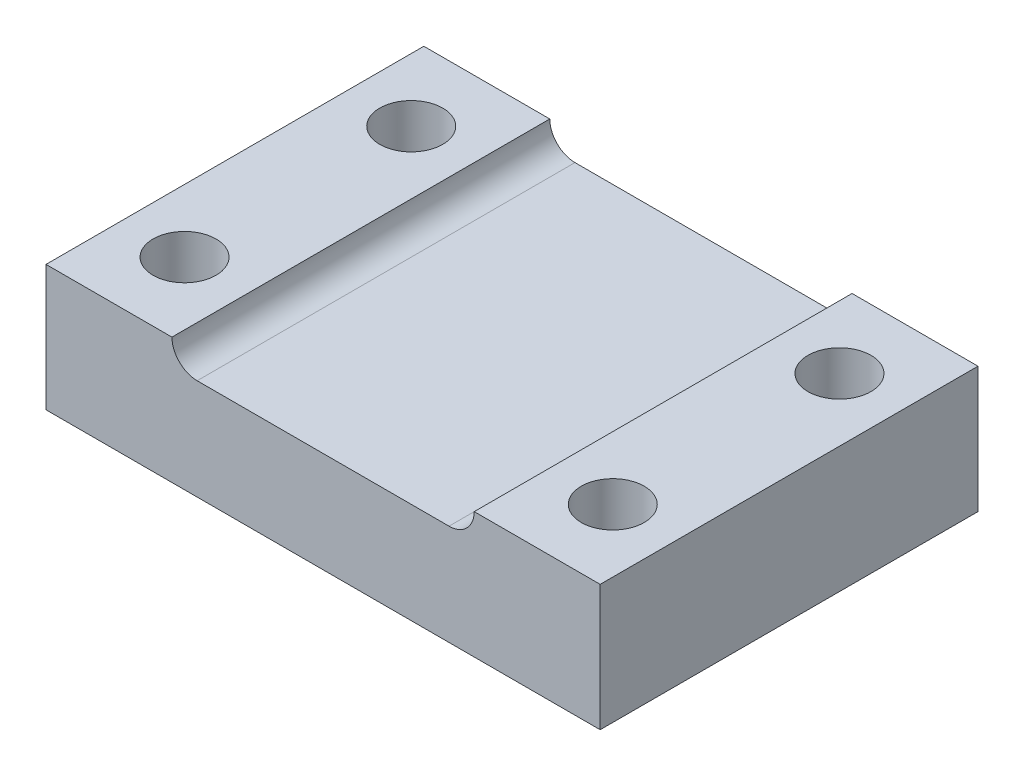
ISO-10303-21;
HEADER;
FILE_DESCRIPTION(('STEP AP214'),'2;1');
FILE_NAME('part.step','',(''),(''),'','','');
FILE_SCHEMA(('AUTOMOTIVE_DESIGN { 1 0 10303 214 1 1 1 1 }'));
ENDSEC;
DATA;
#1=APPLICATION_CONTEXT('core data for automotive mechanical design processes');
#2=APPLICATION_PROTOCOL_DEFINITION('international standard','automotive_design',2000,#1);
#3=PRODUCT_CONTEXT('',#1,'mechanical');
#4=PRODUCT('Part','Part','',(#3));
#5=PRODUCT_RELATED_PRODUCT_CATEGORY('part','',(#4));
#6=PRODUCT_DEFINITION_FORMATION('','',#4);
#7=PRODUCT_DEFINITION_CONTEXT('part definition',#1,'design');
#8=PRODUCT_DEFINITION('design','',#6,#7);
#9=PRODUCT_DEFINITION_SHAPE('','',#8);
#10=(LENGTH_UNIT() NAMED_UNIT(*) SI_UNIT(.MILLI.,.METRE.));
#11=(NAMED_UNIT(*) PLANE_ANGLE_UNIT() SI_UNIT($,.RADIAN.));
#12=(NAMED_UNIT(*) SI_UNIT($,.STERADIAN.) SOLID_ANGLE_UNIT());
#13=UNCERTAINTY_MEASURE_WITH_UNIT(LENGTH_MEASURE(1.E-05),#10,'distance_accuracy_value','');
#14=(GEOMETRIC_REPRESENTATION_CONTEXT(3) GLOBAL_UNCERTAINTY_ASSIGNED_CONTEXT((#13)) GLOBAL_UNIT_ASSIGNED_CONTEXT((#10,
#11,#12)) REPRESENTATION_CONTEXT('',''));
#15=CARTESIAN_POINT('',(0.,0.,0.));
#16=DIRECTION('',(0.,0.,1.));
#17=DIRECTION('',(1.,0.,0.));
#18=AXIS2_PLACEMENT_3D('',#15,#16,#17);
#19=CARTESIAN_POINT('',(9.,0.,-0.00999999999999959));
#20=DIRECTION('',(0.,1.,0.));
#21=DIRECTION('',(0.,0.,1.));
#22=AXIS2_PLACEMENT_3D('',#19,#20,#21);
#23=PLANE('',#22);
#24=CARTESIAN_POINT('',(-8.5,0.,3.));
#25=DIRECTION('',(0.,1.,0.));
#26=DIRECTION('',(0.,0.,-1.));
#27=AXIS2_PLACEMENT_3D('',#24,#25,#26);
#28=CIRCLE('',#27,1.25);
#29=CARTESIAN_POINT('',(-8.5,0.,1.75));
#30=VERTEX_POINT('',#29);
#31=EDGE_CURVE('E406',#30,#30,#28,.T.);
#32=ORIENTED_EDGE('',*,*,#31,.F.);
#33=EDGE_LOOP('',(#32));
#34=FACE_BOUND('',#33,.T.);
#35=CARTESIAN_POINT('',(-8.49999999999999,0.,12.));
#36=DIRECTION('',(0.,1.,0.));
#37=DIRECTION('',(0.,0.,-1.));
#38=AXIS2_PLACEMENT_3D('',#35,#36,#37);
#39=CIRCLE('',#38,1.25);
#40=CARTESIAN_POINT('',(-8.49999999999999,0.,10.75));
#41=VERTEX_POINT('',#40);
#42=EDGE_CURVE('E405',#41,#41,#39,.T.);
#43=ORIENTED_EDGE('',*,*,#42,.F.);
#44=EDGE_LOOP('',(#43));
#45=FACE_BOUND('',#44,.T.);
#46=DIRECTION('',(0.,0.,-1.));
#47=VECTOR('',#46,1.);
#48=CARTESIAN_POINT('',(-6.,0.,15.));
#49=LINE('',#48,#47);
#50=CARTESIAN_POINT('',(-6.,0.,0.));
#51=VERTEX_POINT('',#50);
#52=CARTESIAN_POINT('',(-6.,0.,15.));
#53=VERTEX_POINT('',#52);
#54=EDGE_CURVE('E183',#51,#53,#49,.F.);
#55=ORIENTED_EDGE('',*,*,#54,.F.);
#56=DIRECTION('',(-1.,0.,0.));
#57=VECTOR('',#56,1.);
#58=CARTESIAN_POINT('',(0.,0.,0.));
#59=LINE('',#58,#57);
#60=CARTESIAN_POINT('',(-11.,0.,0.));
#61=VERTEX_POINT('',#60);
#62=EDGE_CURVE('E123',#51,#61,#59,.T.);
#63=ORIENTED_EDGE('',*,*,#62,.T.);
#64=DIRECTION('',(0.,0.,-1.));
#65=VECTOR('',#64,1.);
#66=CARTESIAN_POINT('',(-11.,0.,0.));
#67=LINE('',#66,#65);
#68=CARTESIAN_POINT('',(-11.,0.,15.));
#69=VERTEX_POINT('',#68);
#70=EDGE_CURVE('E161',#69,#61,#67,.T.);
#71=ORIENTED_EDGE('',*,*,#70,.F.);
#72=DIRECTION('',(-1.,0.,0.));
#73=VECTOR('',#72,1.);
#74=CARTESIAN_POINT('',(0.,0.,15.));
#75=LINE('',#74,#73);
#76=EDGE_CURVE('E186',#53,#69,#75,.T.);
#77=ORIENTED_EDGE('',*,*,#76,.F.);
#78=EDGE_LOOP('',(#55,#63,#71,#77));
#79=FACE_BOUND('',#78,.T.);
#80=ADVANCED_FACE('F39',(#34,#45,#79),#23,.T.);
#81=CARTESIAN_POINT('',(8.5,0.,12.));
#82=DIRECTION('',(0.,1.,0.));
#83=DIRECTION('',(0.,0.,1.));
#84=AXIS2_PLACEMENT_3D('',#81,#82,#83);
#85=CIRCLE('',#84,1.25);
#86=CARTESIAN_POINT('',(8.5,0.,13.25));
#87=VERTEX_POINT('',#86);
#88=EDGE_CURVE('E419',#87,#87,#85,.T.);
#89=ORIENTED_EDGE('',*,*,#88,.F.);
#90=EDGE_LOOP('',(#89));
#91=FACE_BOUND('',#90,.T.);
#92=CARTESIAN_POINT('',(8.5,0.,3.));
#93=DIRECTION('',(0.,1.,0.));
#94=DIRECTION('',(0.,0.,1.));
#95=AXIS2_PLACEMENT_3D('',#92,#93,#94);
#96=CIRCLE('',#95,1.25);
#97=CARTESIAN_POINT('',(8.5,0.,4.25));
#98=VERTEX_POINT('',#97);
#99=EDGE_CURVE('E144',#98,#98,#96,.T.);
#100=ORIENTED_EDGE('',*,*,#99,.F.);
#101=EDGE_LOOP('',(#100));
#102=FACE_BOUND('',#101,.T.);
#103=CARTESIAN_POINT('',(11.,0.,15.));
#104=VERTEX_POINT('',#103);
#105=CARTESIAN_POINT('',(6.,0.,15.));
#106=VERTEX_POINT('',#105);
#107=EDGE_CURVE('E189',#104,#106,#75,.T.);
#108=ORIENTED_EDGE('',*,*,#107,.F.);
#109=DIRECTION('',(0.,0.,1.));
#110=VECTOR('',#109,1.);
#111=CARTESIAN_POINT('',(11.,0.,15.));
#112=LINE('',#111,#110);
#113=CARTESIAN_POINT('',(11.,0.,0.));
#114=VERTEX_POINT('',#113);
#115=EDGE_CURVE('E138',#114,#104,#112,.T.);
#116=ORIENTED_EDGE('',*,*,#115,.F.);
#117=CARTESIAN_POINT('',(6.,0.,0.));
#118=VERTEX_POINT('',#117);
#119=EDGE_CURVE('E192',#114,#118,#59,.T.);
#120=ORIENTED_EDGE('',*,*,#119,.T.);
#121=DIRECTION('',(0.,0.,-1.));
#122=VECTOR('',#121,1.);
#123=CARTESIAN_POINT('',(6.,0.,15.));
#124=LINE('',#123,#122);
#125=EDGE_CURVE('E75',#106,#118,#124,.T.);
#126=ORIENTED_EDGE('',*,*,#125,.F.);
#127=EDGE_LOOP('',(#108,#116,#120,#126));
#128=FACE_BOUND('',#127,.T.);
#129=ADVANCED_FACE('F204',(#91,#102,#128),#23,.T.);
#130=CARTESIAN_POINT('',(-5.,-1.,15.));
#131=DIRECTION('',(0.,1.,0.));
#132=DIRECTION('',(-1.,0.,0.));
#133=AXIS2_PLACEMENT_3D('',#130,#131,#132);
#134=PLANE('',#133);
#135=DIRECTION('',(1.,0.,0.));
#136=VECTOR('',#135,1.);
#137=CARTESIAN_POINT('',(-5.,-1.,0.));
#138=LINE('',#137,#136);
#139=CARTESIAN_POINT('',(-5.,-1.,0.));
#140=VERTEX_POINT('',#139);
#141=CARTESIAN_POINT('',(5.,-1.,0.));
#142=VERTEX_POINT('',#141);
#143=EDGE_CURVE('E49',#140,#142,#138,.T.);
#144=ORIENTED_EDGE('',*,*,#143,.F.);
#145=DIRECTION('',(0.,0.,-1.));
#146=VECTOR('',#145,1.);
#147=CARTESIAN_POINT('',(-5.,-1.,15.));
#148=LINE('',#147,#146);
#149=CARTESIAN_POINT('',(-5.,-1.,15.));
#150=VERTEX_POINT('',#149);
#151=EDGE_CURVE('E167',#150,#140,#148,.T.);
#152=ORIENTED_EDGE('',*,*,#151,.F.);
#153=DIRECTION('',(1.,0.,0.));
#154=VECTOR('',#153,1.);
#155=CARTESIAN_POINT('',(-5.,-1.,15.));
#156=LINE('',#155,#154);
#157=CARTESIAN_POINT('',(5.,-1.,15.));
#158=VERTEX_POINT('',#157);
#159=EDGE_CURVE('E66',#150,#158,#156,.T.);
#160=ORIENTED_EDGE('',*,*,#159,.T.);
#161=DIRECTION('',(0.,0.,-1.));
#162=VECTOR('',#161,1.);
#163=CARTESIAN_POINT('',(5.,-1.,15.));
#164=LINE('',#163,#162);
#165=EDGE_CURVE('E171',#158,#142,#164,.T.);
#166=ORIENTED_EDGE('',*,*,#165,.T.);
#167=EDGE_LOOP('',(#144,#152,#160,#166));
#168=FACE_BOUND('',#167,.T.);
#169=ADVANCED_FACE('F206',(#168),#134,.T.);
#170=CARTESIAN_POINT('',(0.,0.,0.));
#171=DIRECTION('',(0.,0.,1.));
#172=DIRECTION('',(1.,0.,0.));
#173=AXIS2_PLACEMENT_3D('',#170,#171,#172);
#174=PLANE('',#173);
#175=ORIENTED_EDGE('',*,*,#119,.F.);
#176=DIRECTION('',(0.,1.,0.));
#177=VECTOR('',#176,1.);
#178=CARTESIAN_POINT('',(11.,0.,0.));
#179=LINE('',#178,#177);
#180=CARTESIAN_POINT('',(11.,-5.,0.));
#181=VERTEX_POINT('',#180);
#182=EDGE_CURVE('E133',#181,#114,#179,.T.);
#183=ORIENTED_EDGE('',*,*,#182,.F.);
#184=DIRECTION('',(1.,0.,0.));
#185=VECTOR('',#184,1.);
#186=CARTESIAN_POINT('',(-9.,-5.,0.));
#187=LINE('',#186,#185);
#188=CARTESIAN_POINT('',(-11.,-5.,0.));
#189=VERTEX_POINT('',#188);
#190=EDGE_CURVE('E124',#189,#181,#187,.T.);
#191=ORIENTED_EDGE('',*,*,#190,.F.);
#192=DIRECTION('',(0.,-1.,0.));
#193=VECTOR('',#192,1.);
#194=CARTESIAN_POINT('',(-11.,0.,0.));
#195=LINE('',#194,#193);
#196=EDGE_CURVE('E152',#61,#189,#195,.T.);
#197=ORIENTED_EDGE('',*,*,#196,.F.);
#198=ORIENTED_EDGE('',*,*,#62,.F.);
#199=CARTESIAN_POINT('',(-5.,0.,0.));
#200=DIRECTION('',(0.,0.,1.));
#201=DIRECTION('',(1.,0.,0.));
#202=AXIS2_PLACEMENT_3D('',#199,#200,#201);
#203=CIRCLE('',#202,1.);
#204=EDGE_CURVE('E11',#51,#140,#203,.T.);
#205=ORIENTED_EDGE('',*,*,#204,.T.);
#206=ORIENTED_EDGE('',*,*,#143,.T.);
#207=CARTESIAN_POINT('',(5.,0.,0.));
#208=DIRECTION('',(0.,0.,1.));
#209=DIRECTION('',(1.,0.,0.));
#210=AXIS2_PLACEMENT_3D('',#207,#208,#209);
#211=CIRCLE('',#210,1.);
#212=EDGE_CURVE('E177',#142,#118,#211,.T.);
#213=ORIENTED_EDGE('',*,*,#212,.T.);
#214=EDGE_LOOP('',(#175,#183,#191,#197,#198,#205,#206,#213));
#215=FACE_BOUND('',#214,.T.);
#216=ADVANCED_FACE('F198',(#215),#174,.F.);
#217=CARTESIAN_POINT('',(0.,0.,15.));
#218=DIRECTION('',(0.,0.,1.));
#219=DIRECTION('',(1.,0.,0.));
#220=AXIS2_PLACEMENT_3D('',#217,#218,#219);
#221=PLANE('',#220);
#222=DIRECTION('',(-1.,0.,0.));
#223=VECTOR('',#222,1.);
#224=CARTESIAN_POINT('',(-9.,-5.,15.));
#225=LINE('',#224,#223);
#226=CARTESIAN_POINT('',(11.,-5.,15.));
#227=VERTEX_POINT('',#226);
#228=CARTESIAN_POINT('',(-11.,-5.,15.));
#229=VERTEX_POINT('',#228);
#230=EDGE_CURVE('E111',#227,#229,#225,.T.);
#231=ORIENTED_EDGE('',*,*,#230,.F.);
#232=DIRECTION('',(0.,-1.,0.));
#233=VECTOR('',#232,1.);
#234=CARTESIAN_POINT('',(11.,0.,15.));
#235=LINE('',#234,#233);
#236=EDGE_CURVE('E116',#104,#227,#235,.T.);
#237=ORIENTED_EDGE('',*,*,#236,.F.);
#238=ORIENTED_EDGE('',*,*,#107,.T.);
#239=CARTESIAN_POINT('',(5.,0.,15.));
#240=DIRECTION('',(0.,0.,1.));
#241=DIRECTION('',(1.,0.,0.));
#242=AXIS2_PLACEMENT_3D('',#239,#240,#241);
#243=CIRCLE('',#242,1.);
#244=EDGE_CURVE('E174',#158,#106,#243,.T.);
#245=ORIENTED_EDGE('',*,*,#244,.F.);
#246=ORIENTED_EDGE('',*,*,#159,.F.);
#247=CARTESIAN_POINT('',(-5.,0.,15.));
#248=DIRECTION('',(0.,0.,1.));
#249=DIRECTION('',(1.,0.,0.));
#250=AXIS2_PLACEMENT_3D('',#247,#248,#249);
#251=CIRCLE('',#250,1.);
#252=EDGE_CURVE('E180',#53,#150,#251,.T.);
#253=ORIENTED_EDGE('',*,*,#252,.F.);
#254=ORIENTED_EDGE('',*,*,#76,.T.);
#255=DIRECTION('',(0.,1.,0.));
#256=VECTOR('',#255,1.);
#257=CARTESIAN_POINT('',(-11.,0.,15.));
#258=LINE('',#257,#256);
#259=EDGE_CURVE('E118',#229,#69,#258,.T.);
#260=ORIENTED_EDGE('',*,*,#259,.F.);
#261=EDGE_LOOP('',(#231,#237,#238,#245,#246,#253,#254,#260));
#262=FACE_BOUND('',#261,.T.);
#263=ADVANCED_FACE('F113',(#262),#221,.T.);
#264=CARTESIAN_POINT('',(5.,0.,15.));
#265=DIRECTION('',(0.,0.,-1.));
#266=DIRECTION('',(-1.,0.,0.));
#267=AXIS2_PLACEMENT_3D('',#264,#265,#266);
#268=CYLINDRICAL_SURFACE('',#267,1.);
#269=ORIENTED_EDGE('',*,*,#244,.T.);
#270=ORIENTED_EDGE('',*,*,#125,.T.);
#271=ORIENTED_EDGE('',*,*,#212,.F.);
#272=ORIENTED_EDGE('',*,*,#165,.F.);
#273=EDGE_LOOP('',(#269,#270,#271,#272));
#274=FACE_BOUND('',#273,.T.);
#275=ADVANCED_FACE('F41',(#274),#268,.F.);
#276=CARTESIAN_POINT('',(-5.,0.,15.));
#277=DIRECTION('',(0.,0.,-1.));
#278=DIRECTION('',(-1.,0.,0.));
#279=AXIS2_PLACEMENT_3D('',#276,#277,#278);
#280=CYLINDRICAL_SURFACE('',#279,1.);
#281=ORIENTED_EDGE('',*,*,#204,.F.);
#282=ORIENTED_EDGE('',*,*,#54,.T.);
#283=ORIENTED_EDGE('',*,*,#252,.T.);
#284=ORIENTED_EDGE('',*,*,#151,.T.);
#285=EDGE_LOOP('',(#281,#282,#283,#284));
#286=FACE_BOUND('',#285,.T.);
#287=ADVANCED_FACE('F209',(#286),#280,.F.);
#288=CARTESIAN_POINT('',(0.,-5.,0.));
#289=DIRECTION('',(0.,-1.,0.));
#290=DIRECTION('',(0.,0.,-1.));
#291=AXIS2_PLACEMENT_3D('',#288,#289,#290);
#292=PLANE('',#291);
#293=ORIENTED_EDGE('',*,*,#230,.T.);
#294=DIRECTION('',(0.,0.,1.));
#295=VECTOR('',#294,1.);
#296=CARTESIAN_POINT('',(-11.,-5.,0.));
#297=LINE('',#296,#295);
#298=EDGE_CURVE('E156',#189,#229,#297,.T.);
#299=ORIENTED_EDGE('',*,*,#298,.F.);
#300=ORIENTED_EDGE('',*,*,#190,.T.);
#301=DIRECTION('',(0.,0.,-1.));
#302=VECTOR('',#301,1.);
#303=CARTESIAN_POINT('',(11.,-5.,15.));
#304=LINE('',#303,#302);
#305=EDGE_CURVE('E127',#227,#181,#304,.T.);
#306=ORIENTED_EDGE('',*,*,#305,.F.);
#307=EDGE_LOOP('',(#293,#299,#300,#306));
#308=FACE_BOUND('',#307,.T.);
#309=ADVANCED_FACE('F128',(#308),#292,.T.);
#310=CARTESIAN_POINT('',(-11.,0.,0.));
#311=DIRECTION('',(-1.,0.,0.));
#312=DIRECTION('',(0.,0.,1.));
#313=AXIS2_PLACEMENT_3D('',#310,#311,#312);
#314=PLANE('',#313);
#315=ORIENTED_EDGE('',*,*,#196,.T.);
#316=ORIENTED_EDGE('',*,*,#298,.T.);
#317=ORIENTED_EDGE('',*,*,#259,.T.);
#318=ORIENTED_EDGE('',*,*,#70,.T.);
#319=EDGE_LOOP('',(#315,#316,#317,#318));
#320=FACE_BOUND('',#319,.T.);
#321=ADVANCED_FACE('F226',(#320),#314,.T.);
#322=CARTESIAN_POINT('',(11.,0.,0.));
#323=DIRECTION('',(1.,0.,0.));
#324=DIRECTION('',(0.,0.,-1.));
#325=AXIS2_PLACEMENT_3D('',#322,#323,#324);
#326=PLANE('',#325);
#327=ORIENTED_EDGE('',*,*,#236,.T.);
#328=ORIENTED_EDGE('',*,*,#305,.T.);
#329=ORIENTED_EDGE('',*,*,#182,.T.);
#330=ORIENTED_EDGE('',*,*,#115,.T.);
#331=EDGE_LOOP('',(#327,#328,#329,#330));
#332=FACE_BOUND('',#331,.T.);
#333=ADVANCED_FACE('F136',(#332),#326,.T.);
#334=CARTESIAN_POINT('',(8.5,-3.,3.));
#335=DIRECTION('',(0.,1.,0.));
#336=DIRECTION('',(0.,0.,1.));
#337=AXIS2_PLACEMENT_3D('',#334,#335,#336);
#338=CYLINDRICAL_SURFACE('',#337,1.25);
#339=CARTESIAN_POINT('',(8.5,-3.,3.));
#340=DIRECTION('',(0.,1.,0.));
#341=DIRECTION('',(0.,0.,1.));
#342=AXIS2_PLACEMENT_3D('',#339,#340,#341);
#343=CIRCLE('',#342,1.25);
#344=CARTESIAN_POINT('',(8.5,-3.,4.25));
#345=VERTEX_POINT('',#344);
#346=EDGE_CURVE('E140',#345,#345,#343,.T.);
#347=ORIENTED_EDGE('',*,*,#346,.F.);
#348=EDGE_LOOP('',(#347));
#349=FACE_BOUND('',#348,.T.);
#350=ORIENTED_EDGE('',*,*,#99,.T.);
#351=EDGE_LOOP('',(#350));
#352=FACE_BOUND('',#351,.T.);
#353=ADVANCED_FACE('F251',(#349,#352),#338,.F.);
#354=CARTESIAN_POINT('',(8.5,-3.,3.));
#355=DIRECTION('',(0.,1.,0.));
#356=DIRECTION('',(0.,0.,1.));
#357=AXIS2_PLACEMENT_3D('',#354,#355,#356);
#358=PLANE('',#357);
#359=ORIENTED_EDGE('',*,*,#346,.T.);
#360=EDGE_LOOP('',(#359));
#361=FACE_BOUND('',#360,.T.);
#362=ADVANCED_FACE('F259',(#361),#358,.T.);
#363=CARTESIAN_POINT('',(8.5,-3.,12.));
#364=DIRECTION('',(0.,1.,0.));
#365=DIRECTION('',(0.,0.,1.));
#366=AXIS2_PLACEMENT_3D('',#363,#364,#365);
#367=CYLINDRICAL_SURFACE('',#366,1.25);
#368=CARTESIAN_POINT('',(8.5,-3.,12.));
#369=DIRECTION('',(0.,1.,0.));
#370=DIRECTION('',(0.,0.,1.));
#371=AXIS2_PLACEMENT_3D('',#368,#369,#370);
#372=CIRCLE('',#371,1.25);
#373=CARTESIAN_POINT('',(8.5,-3.,13.25));
#374=VERTEX_POINT('',#373);
#375=EDGE_CURVE('E423',#374,#374,#372,.T.);
#376=ORIENTED_EDGE('',*,*,#375,.F.);
#377=EDGE_LOOP('',(#376));
#378=FACE_BOUND('',#377,.T.);
#379=ORIENTED_EDGE('',*,*,#88,.T.);
#380=EDGE_LOOP('',(#379));
#381=FACE_BOUND('',#380,.T.);
#382=ADVANCED_FACE('F267',(#378,#381),#367,.F.);
#383=CARTESIAN_POINT('',(8.5,-3.,12.));
#384=DIRECTION('',(0.,1.,0.));
#385=DIRECTION('',(0.,0.,1.));
#386=AXIS2_PLACEMENT_3D('',#383,#384,#385);
#387=PLANE('',#386);
#388=ORIENTED_EDGE('',*,*,#375,.T.);
#389=EDGE_LOOP('',(#388));
#390=FACE_BOUND('',#389,.T.);
#391=ADVANCED_FACE('F275',(#390),#387,.T.);
#392=CARTESIAN_POINT('',(-8.49999999999999,-3.,12.));
#393=DIRECTION('',(0.,1.,0.));
#394=DIRECTION('',(0.,0.,1.));
#395=AXIS2_PLACEMENT_3D('',#392,#393,#394);
#396=CYLINDRICAL_SURFACE('',#395,1.25);
#397=CARTESIAN_POINT('',(-8.49999999999999,-3.,12.));
#398=DIRECTION('',(0.,1.,0.));
#399=DIRECTION('',(0.,0.,-1.));
#400=AXIS2_PLACEMENT_3D('',#397,#398,#399);
#401=CIRCLE('',#400,1.25);
#402=CARTESIAN_POINT('',(-8.49999999999999,-3.,10.75));
#403=VERTEX_POINT('',#402);
#404=EDGE_CURVE('E411',#403,#403,#401,.T.);
#405=ORIENTED_EDGE('',*,*,#404,.F.);
#406=EDGE_LOOP('',(#405));
#407=FACE_BOUND('',#406,.T.);
#408=ORIENTED_EDGE('',*,*,#42,.T.);
#409=EDGE_LOOP('',(#408));
#410=FACE_BOUND('',#409,.T.);
#411=ADVANCED_FACE('F283',(#407,#410),#396,.F.);
#412=CARTESIAN_POINT('',(-8.49999999999999,-3.,12.));
#413=DIRECTION('',(0.,-1.,0.));
#414=DIRECTION('',(0.,0.,-1.));
#415=AXIS2_PLACEMENT_3D('',#412,#413,#414);
#416=PLANE('',#415);
#417=ORIENTED_EDGE('',*,*,#404,.T.);
#418=EDGE_LOOP('',(#417));
#419=FACE_BOUND('',#418,.T.);
#420=ADVANCED_FACE('F291',(#419),#416,.F.);
#421=CARTESIAN_POINT('',(-8.5,-3.,3.));
#422=DIRECTION('',(0.,1.,0.));
#423=DIRECTION('',(0.,0.,1.));
#424=AXIS2_PLACEMENT_3D('',#421,#422,#423);
#425=CYLINDRICAL_SURFACE('',#424,1.25);
#426=CARTESIAN_POINT('',(-8.5,-3.,3.));
#427=DIRECTION('',(0.,1.,0.));
#428=DIRECTION('',(0.,0.,-1.));
#429=AXIS2_PLACEMENT_3D('',#426,#427,#428);
#430=CIRCLE('',#429,1.25);
#431=CARTESIAN_POINT('',(-8.5,-3.,1.75));
#432=VERTEX_POINT('',#431);
#433=EDGE_CURVE('E403',#432,#432,#430,.T.);
#434=ORIENTED_EDGE('',*,*,#433,.F.);
#435=EDGE_LOOP('',(#434));
#436=FACE_BOUND('',#435,.T.);
#437=ORIENTED_EDGE('',*,*,#31,.T.);
#438=EDGE_LOOP('',(#437));
#439=FACE_BOUND('',#438,.T.);
#440=ADVANCED_FACE('F299',(#436,#439),#425,.F.);
#441=CARTESIAN_POINT('',(-8.5,-3.,3.));
#442=DIRECTION('',(0.,-1.,0.));
#443=DIRECTION('',(0.,0.,-1.));
#444=AXIS2_PLACEMENT_3D('',#441,#442,#443);
#445=PLANE('',#444);
#446=ORIENTED_EDGE('',*,*,#433,.T.);
#447=EDGE_LOOP('',(#446));
#448=FACE_BOUND('',#447,.T.);
#449=ADVANCED_FACE('F307',(#448),#445,.F.);
#450=CLOSED_SHELL('',(#80,#129,#169,#216,#263,#275,#287,#309,#321,#333,#353,#362,#382,#391,#411,
#420,#440,#449));
#451=MANIFOLD_SOLID_BREP('B2',#450);
#452=ADVANCED_BREP_SHAPE_REPRESENTATION('',(#18,#451),#14);
#453=SHAPE_DEFINITION_REPRESENTATION(#9,#452);
ENDSEC;
END-ISO-10303-21;
